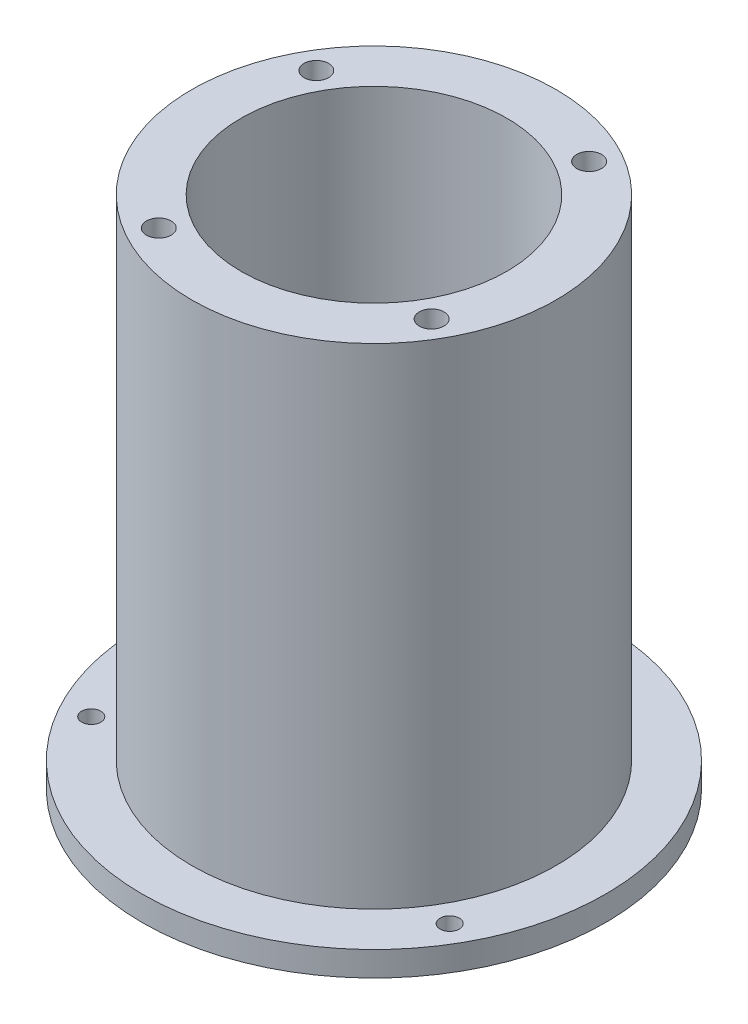
ISO-10303-21;
HEADER;
FILE_DESCRIPTION(('STEP AP214'),'2;1');
FILE_NAME('part.step','',(''),(''),'','','');
FILE_SCHEMA(('AUTOMOTIVE_DESIGN { 1 0 10303 214 1 1 1 1 }'));
ENDSEC;
DATA;
#1=APPLICATION_CONTEXT('core data for automotive mechanical design processes');
#2=APPLICATION_PROTOCOL_DEFINITION('international standard','automotive_design',2000,#1);
#3=PRODUCT_CONTEXT('',#1,'mechanical');
#4=PRODUCT('Part','Part','',(#3));
#5=PRODUCT_RELATED_PRODUCT_CATEGORY('part','',(#4));
#6=PRODUCT_DEFINITION_FORMATION('','',#4);
#7=PRODUCT_DEFINITION_CONTEXT('part definition',#1,'design');
#8=PRODUCT_DEFINITION('design','',#6,#7);
#9=PRODUCT_DEFINITION_SHAPE('','',#8);
#10=(LENGTH_UNIT() NAMED_UNIT(*) SI_UNIT(.MILLI.,.METRE.));
#11=(NAMED_UNIT(*) PLANE_ANGLE_UNIT() SI_UNIT($,.RADIAN.));
#12=(NAMED_UNIT(*) SI_UNIT($,.STERADIAN.) SOLID_ANGLE_UNIT());
#13=UNCERTAINTY_MEASURE_WITH_UNIT(LENGTH_MEASURE(1.E-05),#10,'distance_accuracy_value','');
#14=(GEOMETRIC_REPRESENTATION_CONTEXT(3) GLOBAL_UNCERTAINTY_ASSIGNED_CONTEXT((#13)) GLOBAL_UNIT_ASSIGNED_CONTEXT((#10,
#11,#12)) REPRESENTATION_CONTEXT('',''));
#15=CARTESIAN_POINT('',(0.,0.,0.));
#16=DIRECTION('',(0.,0.,1.));
#17=DIRECTION('',(1.,0.,0.));
#18=AXIS2_PLACEMENT_3D('',#15,#16,#17);
#19=CARTESIAN_POINT('',(0.,4.,0.));
#20=DIRECTION('',(0.,1.,0.));
#21=DIRECTION('',(0.,0.,1.));
#22=AXIS2_PLACEMENT_3D('',#19,#20,#21);
#23=PLANE('',#22);
#24=CARTESIAN_POINT('',(-29.0118510267786,4.,16.7500000000001));
#25=DIRECTION('',(0.,1.,0.));
#26=DIRECTION('',(0.866025403784436,0.,-0.500000000000004));
#27=AXIS2_PLACEMENT_3D('',#24,#25,#26);
#28=CIRCLE('',#27,1.55);
#29=CARTESIAN_POINT('',(-27.6695116509127,4.,15.9750000000001));
#30=VERTEX_POINT('',#29);
#31=EDGE_CURVE('E85',#30,#30,#28,.T.);
#32=ORIENTED_EDGE('',*,*,#31,.F.);
#33=EDGE_LOOP('',(#32));
#34=FACE_BOUND('',#33,.T.);
#35=CARTESIAN_POINT('',(29.0118510267789,4.,16.7499999999997));
#36=DIRECTION('',(0.,1.,0.));
#37=DIRECTION('',(-0.866025403784443,0.,-0.499999999999992));
#38=AXIS2_PLACEMENT_3D('',#35,#36,#37);
#39=CIRCLE('',#38,1.55);
#40=CARTESIAN_POINT('',(27.669511650913,4.,15.9749999999997));
#41=VERTEX_POINT('',#40);
#42=EDGE_CURVE('E76',#41,#41,#39,.T.);
#43=ORIENTED_EDGE('',*,*,#42,.F.);
#44=EDGE_LOOP('',(#43));
#45=FACE_BOUND('',#44,.T.);
#46=CARTESIAN_POINT('',(0.,4.,-33.5));
#47=DIRECTION('',(0.,1.,0.));
#48=DIRECTION('',(0.,0.,1.));
#49=AXIS2_PLACEMENT_3D('',#46,#47,#48);
#50=CIRCLE('',#49,1.55);
#51=CARTESIAN_POINT('',(0.,4.,-31.95));
#52=VERTEX_POINT('',#51);
#53=EDGE_CURVE('E68',#52,#52,#50,.T.);
#54=ORIENTED_EDGE('',*,*,#53,.F.);
#55=EDGE_LOOP('',(#54));
#56=FACE_BOUND('',#55,.T.);
#57=CARTESIAN_POINT('',(0.,4.,0.));
#58=DIRECTION('',(0.,1.,0.));
#59=DIRECTION('',(0.,0.,1.));
#60=AXIS2_PLACEMENT_3D('',#57,#58,#59);
#61=CIRCLE('',#60,37.5);
#62=CARTESIAN_POINT('',(0.,4.,37.5));
#63=VERTEX_POINT('',#62);
#64=EDGE_CURVE('E10',#63,#63,#61,.T.);
#65=ORIENTED_EDGE('',*,*,#64,.T.);
#66=EDGE_LOOP('',(#65));
#67=FACE_BOUND('',#66,.T.);
#68=CARTESIAN_POINT('',(0.,4.,0.));
#69=DIRECTION('',(0.,1.,0.));
#70=DIRECTION('',(0.,0.,1.));
#71=AXIS2_PLACEMENT_3D('',#68,#69,#70);
#72=CIRCLE('',#71,29.5);
#73=CARTESIAN_POINT('',(0.,4.,29.5));
#74=VERTEX_POINT('',#73);
#75=EDGE_CURVE('E56',#74,#74,#72,.T.);
#76=ORIENTED_EDGE('',*,*,#75,.F.);
#77=EDGE_LOOP('',(#76));
#78=FACE_BOUND('',#77,.T.);
#79=ADVANCED_FACE('F37',(#34,#45,#56,#67,#78),#23,.T.);
#80=CARTESIAN_POINT('',(0.,0.,0.));
#81=DIRECTION('',(0.,1.,0.));
#82=DIRECTION('',(0.,0.,1.));
#83=AXIS2_PLACEMENT_3D('',#80,#81,#82);
#84=PLANE('',#83);
#85=CARTESIAN_POINT('',(-29.0118510267786,0.,16.7500000000001));
#86=DIRECTION('',(0.,1.,0.));
#87=DIRECTION('',(0.866025403784436,0.,-0.500000000000004));
#88=AXIS2_PLACEMENT_3D('',#85,#86,#87);
#89=CIRCLE('',#88,1.55);
#90=CARTESIAN_POINT('',(-27.6695116509127,0.,15.9750000000001));
#91=VERTEX_POINT('',#90);
#92=EDGE_CURVE('E72',#91,#91,#89,.T.);
#93=ORIENTED_EDGE('',*,*,#92,.T.);
#94=EDGE_LOOP('',(#93));
#95=FACE_BOUND('',#94,.T.);
#96=CARTESIAN_POINT('',(29.0118510267789,0.,16.7499999999997));
#97=DIRECTION('',(0.,1.,0.));
#98=DIRECTION('',(-0.866025403784443,0.,-0.499999999999992));
#99=AXIS2_PLACEMENT_3D('',#96,#97,#98);
#100=CIRCLE('',#99,1.55);
#101=CARTESIAN_POINT('',(27.669511650913,0.,15.9749999999997));
#102=VERTEX_POINT('',#101);
#103=EDGE_CURVE('E80',#102,#102,#100,.T.);
#104=ORIENTED_EDGE('',*,*,#103,.T.);
#105=EDGE_LOOP('',(#104));
#106=FACE_BOUND('',#105,.T.);
#107=CARTESIAN_POINT('',(0.,0.,-33.5));
#108=DIRECTION('',(0.,1.,0.));
#109=DIRECTION('',(0.,0.,1.));
#110=AXIS2_PLACEMENT_3D('',#107,#108,#109);
#111=CIRCLE('',#110,1.55);
#112=CARTESIAN_POINT('',(0.,0.,-31.95));
#113=VERTEX_POINT('',#112);
#114=EDGE_CURVE('E67',#113,#113,#111,.T.);
#115=ORIENTED_EDGE('',*,*,#114,.T.);
#116=EDGE_LOOP('',(#115));
#117=FACE_BOUND('',#116,.T.);
#118=CARTESIAN_POINT('',(0.,0.,0.));
#119=DIRECTION('',(0.,1.,0.));
#120=DIRECTION('',(0.,0.,1.));
#121=AXIS2_PLACEMENT_3D('',#118,#119,#120);
#122=CIRCLE('',#121,37.5);
#123=CARTESIAN_POINT('',(0.,0.,37.5));
#124=VERTEX_POINT('',#123);
#125=EDGE_CURVE('E41',#124,#124,#122,.T.);
#126=ORIENTED_EDGE('',*,*,#125,.F.);
#127=EDGE_LOOP('',(#126));
#128=FACE_BOUND('',#127,.T.);
#129=CARTESIAN_POINT('',(0.,0.,0.));
#130=DIRECTION('',(0.,1.,0.));
#131=DIRECTION('',(0.,0.,1.));
#132=AXIS2_PLACEMENT_3D('',#129,#130,#131);
#133=CIRCLE('',#132,21.5);
#134=CARTESIAN_POINT('',(0.,0.,21.5));
#135=VERTEX_POINT('',#134);
#136=EDGE_CURVE('E50',#135,#135,#133,.T.);
#137=ORIENTED_EDGE('',*,*,#136,.T.);
#138=EDGE_LOOP('',(#137));
#139=FACE_BOUND('',#138,.T.);
#140=ADVANCED_FACE('F155',(#95,#106,#117,#128,#139),#84,.F.);
#141=CARTESIAN_POINT('',(0.,4.,0.));
#142=DIRECTION('',(0.,-1.,0.));
#143=DIRECTION('',(0.,0.,-1.));
#144=AXIS2_PLACEMENT_3D('',#141,#142,#143);
#145=CYLINDRICAL_SURFACE('',#144,37.5);
#146=ORIENTED_EDGE('',*,*,#64,.F.);
#147=EDGE_LOOP('',(#146));
#148=FACE_BOUND('',#147,.T.);
#149=ORIENTED_EDGE('',*,*,#125,.T.);
#150=EDGE_LOOP('',(#149));
#151=FACE_BOUND('',#150,.T.);
#152=ADVANCED_FACE('F39',(#148,#151),#145,.T.);
#153=CARTESIAN_POINT('',(0.,4.,0.));
#154=DIRECTION('',(0.,-1.,0.));
#155=DIRECTION('',(0.,0.,-1.));
#156=AXIS2_PLACEMENT_3D('',#153,#154,#155);
#157=CYLINDRICAL_SURFACE('',#156,21.5);
#158=ORIENTED_EDGE('',*,*,#136,.F.);
#159=EDGE_LOOP('',(#158));
#160=FACE_BOUND('',#159,.T.);
#161=CARTESIAN_POINT('',(0.,83.3,0.));
#162=DIRECTION('',(0.,1.,0.));
#163=DIRECTION('',(0.,0.,1.));
#164=AXIS2_PLACEMENT_3D('',#161,#162,#163);
#165=CIRCLE('',#164,21.5);
#166=CARTESIAN_POINT('',(0.,83.3,21.5));
#167=VERTEX_POINT('',#166);
#168=EDGE_CURVE('E60',#167,#167,#165,.T.);
#169=ORIENTED_EDGE('',*,*,#168,.T.);
#170=EDGE_LOOP('',(#169));
#171=FACE_BOUND('',#170,.T.);
#172=ADVANCED_FACE('F137',(#160,#171),#157,.F.);
#173=CARTESIAN_POINT('',(0.,83.3,0.));
#174=DIRECTION('',(0.,1.,0.));
#175=DIRECTION('',(0.,0.,1.));
#176=AXIS2_PLACEMENT_3D('',#173,#174,#175);
#177=PLANE('',#176);
#178=CARTESIAN_POINT('',(-12.7499999999999,83.3,22.0836477965033));
#179=DIRECTION('',(0.,1.,0.));
#180=DIRECTION('',(1.,0.,0.));
#181=AXIS2_PLACEMENT_3D('',#178,#179,#180);
#182=CIRCLE('',#181,2.);
#183=CARTESIAN_POINT('',(-10.7499999999999,83.3,22.0836477965033));
#184=VERTEX_POINT('',#183);
#185=EDGE_CURVE('E116',#184,#184,#182,.T.);
#186=ORIENTED_EDGE('',*,*,#185,.F.);
#187=EDGE_LOOP('',(#186));
#188=FACE_BOUND('',#187,.T.);
#189=CARTESIAN_POINT('',(22.0836477965032,83.3,12.7499999999999));
#190=DIRECTION('',(0.,1.,0.));
#191=DIRECTION('',(0.,0.,-1.));
#192=AXIS2_PLACEMENT_3D('',#189,#190,#191);
#193=CIRCLE('',#192,2.);
#194=CARTESIAN_POINT('',(22.0836477965032,83.3,10.7499999999999));
#195=VERTEX_POINT('',#194);
#196=EDGE_CURVE('E108',#195,#195,#193,.T.);
#197=ORIENTED_EDGE('',*,*,#196,.F.);
#198=EDGE_LOOP('',(#197));
#199=FACE_BOUND('',#198,.T.);
#200=CARTESIAN_POINT('',(12.7499999999997,83.3,-22.0836477965033));
#201=DIRECTION('',(0.,1.,0.));
#202=DIRECTION('',(-1.,0.,0.));
#203=AXIS2_PLACEMENT_3D('',#200,#201,#202);
#204=CIRCLE('',#203,2.);
#205=CARTESIAN_POINT('',(10.7499999999997,83.3,-22.0836477965033));
#206=VERTEX_POINT('',#205);
#207=EDGE_CURVE('E100',#206,#206,#204,.T.);
#208=ORIENTED_EDGE('',*,*,#207,.F.);
#209=EDGE_LOOP('',(#208));
#210=FACE_BOUND('',#209,.T.);
#211=CARTESIAN_POINT('',(-22.0836477965032,83.3,-12.7499999999999));
#212=DIRECTION('',(0.,1.,0.));
#213=DIRECTION('',(0.,0.,1.));
#214=AXIS2_PLACEMENT_3D('',#211,#212,#213);
#215=CIRCLE('',#214,2.);
#216=CARTESIAN_POINT('',(-22.0836477965032,83.3,-10.7499999999999));
#217=VERTEX_POINT('',#216);
#218=EDGE_CURVE('E92',#217,#217,#215,.T.);
#219=ORIENTED_EDGE('',*,*,#218,.F.);
#220=EDGE_LOOP('',(#219));
#221=FACE_BOUND('',#220,.T.);
#222=CARTESIAN_POINT('',(0.,83.3,0.));
#223=DIRECTION('',(0.,1.,0.));
#224=DIRECTION('',(0.,0.,1.));
#225=AXIS2_PLACEMENT_3D('',#222,#223,#224);
#226=CIRCLE('',#225,29.5);
#227=CARTESIAN_POINT('',(0.,83.3,29.5));
#228=VERTEX_POINT('',#227);
#229=EDGE_CURVE('E55',#228,#228,#226,.T.);
#230=ORIENTED_EDGE('',*,*,#229,.T.);
#231=EDGE_LOOP('',(#230));
#232=FACE_BOUND('',#231,.T.);
#233=ORIENTED_EDGE('',*,*,#168,.F.);
#234=EDGE_LOOP('',(#233));
#235=FACE_BOUND('',#234,.T.);
#236=ADVANCED_FACE('F133',(#188,#199,#210,#221,#232,#235),#177,.T.);
#237=CARTESIAN_POINT('',(0.,83.3,0.));
#238=DIRECTION('',(0.,-1.,0.));
#239=DIRECTION('',(0.,0.,-1.));
#240=AXIS2_PLACEMENT_3D('',#237,#238,#239);
#241=CYLINDRICAL_SURFACE('',#240,29.5);
#242=ORIENTED_EDGE('',*,*,#229,.F.);
#243=EDGE_LOOP('',(#242));
#244=FACE_BOUND('',#243,.T.);
#245=ORIENTED_EDGE('',*,*,#75,.T.);
#246=EDGE_LOOP('',(#245));
#247=FACE_BOUND('',#246,.T.);
#248=ADVANCED_FACE('F136',(#244,#247),#241,.T.);
#249=CARTESIAN_POINT('',(0.,0.,-33.5));
#250=DIRECTION('',(0.,1.,0.));
#251=DIRECTION('',(0.,0.,1.));
#252=AXIS2_PLACEMENT_3D('',#249,#250,#251);
#253=CYLINDRICAL_SURFACE('',#252,1.55);
#254=ORIENTED_EDGE('',*,*,#114,.F.);
#255=EDGE_LOOP('',(#254));
#256=FACE_BOUND('',#255,.T.);
#257=ORIENTED_EDGE('',*,*,#53,.T.);
#258=EDGE_LOOP('',(#257));
#259=FACE_BOUND('',#258,.T.);
#260=ADVANCED_FACE('F175',(#256,#259),#253,.F.);
#261=CARTESIAN_POINT('',(29.0118510267789,0.,16.7499999999997));
#262=DIRECTION('',(0.,1.,0.));
#263=DIRECTION('',(0.,0.,1.));
#264=AXIS2_PLACEMENT_3D('',#261,#262,#263);
#265=CYLINDRICAL_SURFACE('',#264,1.55);
#266=ORIENTED_EDGE('',*,*,#103,.F.);
#267=EDGE_LOOP('',(#266));
#268=FACE_BOUND('',#267,.T.);
#269=ORIENTED_EDGE('',*,*,#42,.T.);
#270=EDGE_LOOP('',(#269));
#271=FACE_BOUND('',#270,.T.);
#272=ADVANCED_FACE('F180',(#268,#271),#265,.F.);
#273=CARTESIAN_POINT('',(-29.0118510267786,0.,16.7500000000001));
#274=DIRECTION('',(0.,1.,0.));
#275=DIRECTION('',(0.,0.,1.));
#276=AXIS2_PLACEMENT_3D('',#273,#274,#275);
#277=CYLINDRICAL_SURFACE('',#276,1.55);
#278=ORIENTED_EDGE('',*,*,#92,.F.);
#279=EDGE_LOOP('',(#278));
#280=FACE_BOUND('',#279,.T.);
#281=ORIENTED_EDGE('',*,*,#31,.T.);
#282=EDGE_LOOP('',(#281));
#283=FACE_BOUND('',#282,.T.);
#284=ADVANCED_FACE('F186',(#280,#283),#277,.F.);
#285=CARTESIAN_POINT('',(-22.0836477965032,77.3,-12.7499999999999));
#286=DIRECTION('',(0.,1.,0.));
#287=DIRECTION('',(0.,0.,1.));
#288=AXIS2_PLACEMENT_3D('',#285,#286,#287);
#289=CYLINDRICAL_SURFACE('',#288,2.);
#290=CARTESIAN_POINT('',(-22.0836477965032,77.3,-12.7499999999999));
#291=DIRECTION('',(0.,1.,0.));
#292=DIRECTION('',(0.,0.,1.));
#293=AXIS2_PLACEMENT_3D('',#290,#291,#292);
#294=CIRCLE('',#293,2.);
#295=CARTESIAN_POINT('',(-22.0836477965032,77.3,-10.7499999999999));
#296=VERTEX_POINT('',#295);
#297=EDGE_CURVE('E81',#296,#296,#294,.T.);
#298=ORIENTED_EDGE('',*,*,#297,.F.);
#299=EDGE_LOOP('',(#298));
#300=FACE_BOUND('',#299,.T.);
#301=ORIENTED_EDGE('',*,*,#218,.T.);
#302=EDGE_LOOP('',(#301));
#303=FACE_BOUND('',#302,.T.);
#304=ADVANCED_FACE('F190',(#300,#303),#289,.F.);
#305=CARTESIAN_POINT('',(0.,77.3,0.));
#306=DIRECTION('',(0.,1.,0.));
#307=DIRECTION('',(0.,0.,1.));
#308=AXIS2_PLACEMENT_3D('',#305,#306,#307);
#309=PLANE('',#308);
#310=ORIENTED_EDGE('',*,*,#297,.T.);
#311=EDGE_LOOP('',(#310));
#312=FACE_BOUND('',#311,.T.);
#313=ADVANCED_FACE('F194',(#312),#309,.T.);
#314=CARTESIAN_POINT('',(12.7499999999997,77.3,-22.0836477965033));
#315=DIRECTION('',(0.,1.,0.));
#316=DIRECTION('',(0.,0.,1.));
#317=AXIS2_PLACEMENT_3D('',#314,#315,#316);
#318=CYLINDRICAL_SURFACE('',#317,2.);
#319=CARTESIAN_POINT('',(12.7499999999997,77.3,-22.0836477965033));
#320=DIRECTION('',(0.,1.,0.));
#321=DIRECTION('',(-1.,0.,0.));
#322=AXIS2_PLACEMENT_3D('',#319,#320,#321);
#323=CIRCLE('',#322,2.);
#324=CARTESIAN_POINT('',(10.7499999999997,77.3,-22.0836477965033));
#325=VERTEX_POINT('',#324);
#326=EDGE_CURVE('E104',#325,#325,#323,.T.);
#327=ORIENTED_EDGE('',*,*,#326,.F.);
#328=EDGE_LOOP('',(#327));
#329=FACE_BOUND('',#328,.T.);
#330=ORIENTED_EDGE('',*,*,#207,.T.);
#331=EDGE_LOOP('',(#330));
#332=FACE_BOUND('',#331,.T.);
#333=ADVANCED_FACE('F198',(#329,#332),#318,.F.);
#334=CARTESIAN_POINT('',(0.,77.3,0.));
#335=DIRECTION('',(0.,1.,0.));
#336=DIRECTION('',(-1.,0.,0.));
#337=AXIS2_PLACEMENT_3D('',#334,#335,#336);
#338=PLANE('',#337);
#339=ORIENTED_EDGE('',*,*,#326,.T.);
#340=EDGE_LOOP('',(#339));
#341=FACE_BOUND('',#340,.T.);
#342=ADVANCED_FACE('F202',(#341),#338,.T.);
#343=CARTESIAN_POINT('',(22.0836477965032,77.3,12.7499999999999));
#344=DIRECTION('',(0.,1.,0.));
#345=DIRECTION('',(0.,0.,1.));
#346=AXIS2_PLACEMENT_3D('',#343,#344,#345);
#347=CYLINDRICAL_SURFACE('',#346,2.);
#348=CARTESIAN_POINT('',(22.0836477965032,77.3,12.7499999999999));
#349=DIRECTION('',(0.,1.,0.));
#350=DIRECTION('',(0.,0.,-1.));
#351=AXIS2_PLACEMENT_3D('',#348,#349,#350);
#352=CIRCLE('',#351,2.);
#353=CARTESIAN_POINT('',(22.0836477965032,77.3,10.7499999999999));
#354=VERTEX_POINT('',#353);
#355=EDGE_CURVE('E112',#354,#354,#352,.T.);
#356=ORIENTED_EDGE('',*,*,#355,.F.);
#357=EDGE_LOOP('',(#356));
#358=FACE_BOUND('',#357,.T.);
#359=ORIENTED_EDGE('',*,*,#196,.T.);
#360=EDGE_LOOP('',(#359));
#361=FACE_BOUND('',#360,.T.);
#362=ADVANCED_FACE('F206',(#358,#361),#347,.F.);
#363=CARTESIAN_POINT('',(0.,77.3,0.));
#364=DIRECTION('',(0.,1.,0.));
#365=DIRECTION('',(0.,0.,-1.));
#366=AXIS2_PLACEMENT_3D('',#363,#364,#365);
#367=PLANE('',#366);
#368=ORIENTED_EDGE('',*,*,#355,.T.);
#369=EDGE_LOOP('',(#368));
#370=FACE_BOUND('',#369,.T.);
#371=ADVANCED_FACE('F129',(#370),#367,.T.);
#372=CARTESIAN_POINT('',(-12.7499999999999,77.3,22.0836477965033));
#373=DIRECTION('',(0.,1.,0.));
#374=DIRECTION('',(0.,0.,1.));
#375=AXIS2_PLACEMENT_3D('',#372,#373,#374);
#376=CYLINDRICAL_SURFACE('',#375,2.);
#377=CARTESIAN_POINT('',(-12.7499999999999,77.3,22.0836477965033));
#378=DIRECTION('',(0.,1.,0.));
#379=DIRECTION('',(1.,0.,0.));
#380=AXIS2_PLACEMENT_3D('',#377,#378,#379);
#381=CIRCLE('',#380,2.);
#382=CARTESIAN_POINT('',(-10.7499999999999,77.3,22.0836477965033));
#383=VERTEX_POINT('',#382);
#384=EDGE_CURVE('E96',#383,#383,#381,.T.);
#385=ORIENTED_EDGE('',*,*,#384,.F.);
#386=EDGE_LOOP('',(#385));
#387=FACE_BOUND('',#386,.T.);
#388=ORIENTED_EDGE('',*,*,#185,.T.);
#389=EDGE_LOOP('',(#388));
#390=FACE_BOUND('',#389,.T.);
#391=ADVANCED_FACE('F126',(#387,#390),#376,.F.);
#392=CARTESIAN_POINT('',(0.,77.3,0.));
#393=DIRECTION('',(0.,1.,0.));
#394=DIRECTION('',(1.,0.,0.));
#395=AXIS2_PLACEMENT_3D('',#392,#393,#394);
#396=PLANE('',#395);
#397=ORIENTED_EDGE('',*,*,#384,.T.);
#398=EDGE_LOOP('',(#397));
#399=FACE_BOUND('',#398,.T.);
#400=ADVANCED_FACE('F124',(#399),#396,.T.);
#401=CLOSED_SHELL('',(#79,#140,#152,#172,#236,#248,#260,#272,#284,#304,#313,#333,#342,#362,#371,
#391,#400));
#402=MANIFOLD_SOLID_BREP('B2',#401);
#403=ADVANCED_BREP_SHAPE_REPRESENTATION('',(#18,#402),#14);
#404=SHAPE_DEFINITION_REPRESENTATION(#9,#403);
ENDSEC;
END-ISO-10303-21;
